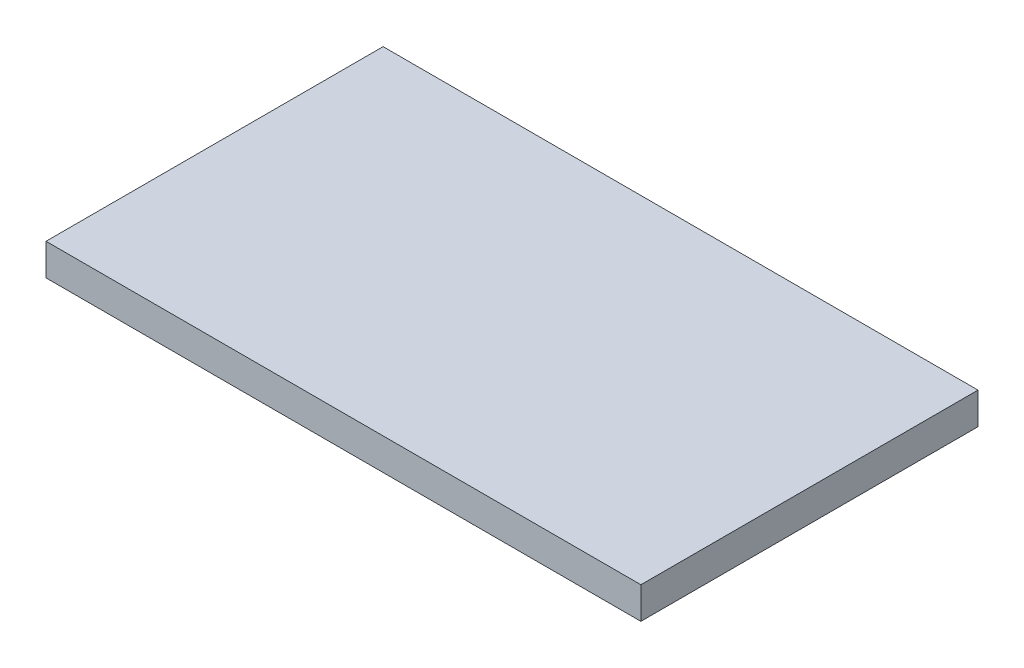
ISO-10303-21;
HEADER;
FILE_DESCRIPTION(('STEP AP214'),'2;1');
FILE_NAME('part.step','',(''),(''),'','','');
FILE_SCHEMA(('AUTOMOTIVE_DESIGN { 1 0 10303 214 1 1 1 1 }'));
ENDSEC;
DATA;
#1=APPLICATION_CONTEXT('core data for automotive mechanical design processes');
#2=APPLICATION_PROTOCOL_DEFINITION('international standard','automotive_design',2000,#1);
#3=PRODUCT_CONTEXT('',#1,'mechanical');
#4=PRODUCT('Part','Part','',(#3));
#5=PRODUCT_RELATED_PRODUCT_CATEGORY('part','',(#4));
#6=PRODUCT_DEFINITION_FORMATION('','',#4);
#7=PRODUCT_DEFINITION_CONTEXT('part definition',#1,'design');
#8=PRODUCT_DEFINITION('design','',#6,#7);
#9=PRODUCT_DEFINITION_SHAPE('','',#8);
#10=(LENGTH_UNIT() NAMED_UNIT(*) SI_UNIT(.MILLI.,.METRE.));
#11=(NAMED_UNIT(*) PLANE_ANGLE_UNIT() SI_UNIT($,.RADIAN.));
#12=(NAMED_UNIT(*) SI_UNIT($,.STERADIAN.) SOLID_ANGLE_UNIT());
#13=UNCERTAINTY_MEASURE_WITH_UNIT(LENGTH_MEASURE(1.E-05),#10,'distance_accuracy_value','');
#14=(GEOMETRIC_REPRESENTATION_CONTEXT(3) GLOBAL_UNCERTAINTY_ASSIGNED_CONTEXT((#13)) GLOBAL_UNIT_ASSIGNED_CONTEXT((#10,
#11,#12)) REPRESENTATION_CONTEXT('',''));
#15=CARTESIAN_POINT('',(0.,0.,0.));
#16=DIRECTION('',(0.,0.,1.));
#17=DIRECTION('',(1.,0.,0.));
#18=AXIS2_PLACEMENT_3D('',#15,#16,#17);
#19=CARTESIAN_POINT('',(-75.,8.,42.5));
#20=DIRECTION('',(1.,0.,0.));
#21=DIRECTION('',(0.,0.,-1.));
#22=AXIS2_PLACEMENT_3D('',#19,#20,#21);
#23=PLANE('',#22);
#24=DIRECTION('',(0.,0.,1.));
#25=VECTOR('',#24,1.);
#26=CARTESIAN_POINT('',(-75.,0.,42.5));
#27=LINE('',#26,#25);
#28=CARTESIAN_POINT('',(-75.,0.,-42.5));
#29=VERTEX_POINT('',#28);
#30=CARTESIAN_POINT('',(-75.,0.,42.5));
#31=VERTEX_POINT('',#30);
#32=EDGE_CURVE('E97',#29,#31,#27,.T.);
#33=ORIENTED_EDGE('',*,*,#32,.T.);
#34=DIRECTION('',(0.,-1.,0.));
#35=VECTOR('',#34,1.);
#36=CARTESIAN_POINT('',(-75.,8.,42.5));
#37=LINE('',#36,#35);
#38=CARTESIAN_POINT('',(-75.,8.,42.5));
#39=VERTEX_POINT('',#38);
#40=EDGE_CURVE('E11',#39,#31,#37,.T.);
#41=ORIENTED_EDGE('',*,*,#40,.F.);
#42=DIRECTION('',(0.,0.,1.));
#43=VECTOR('',#42,1.);
#44=CARTESIAN_POINT('',(-75.,8.,42.5));
#45=LINE('',#44,#43);
#46=CARTESIAN_POINT('',(-75.,8.,-42.5));
#47=VERTEX_POINT('',#46);
#48=EDGE_CURVE('E85',#47,#39,#45,.T.);
#49=ORIENTED_EDGE('',*,*,#48,.F.);
#50=DIRECTION('',(0.,-1.,0.));
#51=VECTOR('',#50,1.);
#52=CARTESIAN_POINT('',(-75.,8.,-42.5));
#53=LINE('',#52,#51);
#54=EDGE_CURVE('E93',#47,#29,#53,.T.);
#55=ORIENTED_EDGE('',*,*,#54,.T.);
#56=EDGE_LOOP('',(#33,#41,#49,#55));
#57=FACE_BOUND('',#56,.T.);
#58=ADVANCED_FACE('F34',(#57),#23,.F.);
#59=CARTESIAN_POINT('',(75.,8.,42.5));
#60=DIRECTION('',(0.,0.,-1.));
#61=DIRECTION('',(-1.,0.,0.));
#62=AXIS2_PLACEMENT_3D('',#59,#60,#61);
#63=PLANE('',#62);
#64=DIRECTION('',(1.,0.,0.));
#65=VECTOR('',#64,1.);
#66=CARTESIAN_POINT('',(75.,0.,42.5));
#67=LINE('',#66,#65);
#68=CARTESIAN_POINT('',(75.,0.,42.5));
#69=VERTEX_POINT('',#68);
#70=EDGE_CURVE('E89',#31,#69,#67,.T.);
#71=ORIENTED_EDGE('',*,*,#70,.T.);
#72=DIRECTION('',(0.,-1.,0.));
#73=VECTOR('',#72,1.);
#74=CARTESIAN_POINT('',(75.,8.,42.5));
#75=LINE('',#74,#73);
#76=CARTESIAN_POINT('',(75.,8.,42.5));
#77=VERTEX_POINT('',#76);
#78=EDGE_CURVE('E42',#77,#69,#75,.T.);
#79=ORIENTED_EDGE('',*,*,#78,.F.);
#80=DIRECTION('',(1.,0.,0.));
#81=VECTOR('',#80,1.);
#82=CARTESIAN_POINT('',(75.,8.,42.5));
#83=LINE('',#82,#81);
#84=EDGE_CURVE('E80',#39,#77,#83,.T.);
#85=ORIENTED_EDGE('',*,*,#84,.F.);
#86=ORIENTED_EDGE('',*,*,#40,.T.);
#87=EDGE_LOOP('',(#71,#79,#85,#86));
#88=FACE_BOUND('',#87,.T.);
#89=ADVANCED_FACE('F88',(#88),#63,.F.);
#90=CARTESIAN_POINT('',(75.,8.,42.5));
#91=DIRECTION('',(-1.,0.,0.));
#92=DIRECTION('',(0.,0.,1.));
#93=AXIS2_PLACEMENT_3D('',#90,#91,#92);
#94=PLANE('',#93);
#95=DIRECTION('',(0.,0.,-1.));
#96=VECTOR('',#95,1.);
#97=CARTESIAN_POINT('',(75.,0.,42.5));
#98=LINE('',#97,#96);
#99=CARTESIAN_POINT('',(75.,0.,-42.5));
#100=VERTEX_POINT('',#99);
#101=EDGE_CURVE('E67',#69,#100,#98,.T.);
#102=ORIENTED_EDGE('',*,*,#101,.T.);
#103=DIRECTION('',(0.,-1.,0.));
#104=VECTOR('',#103,1.);
#105=CARTESIAN_POINT('',(75.,8.,-42.5));
#106=LINE('',#105,#104);
#107=CARTESIAN_POINT('',(75.,8.,-42.5));
#108=VERTEX_POINT('',#107);
#109=EDGE_CURVE('E90',#108,#100,#106,.T.);
#110=ORIENTED_EDGE('',*,*,#109,.F.);
#111=DIRECTION('',(0.,0.,-1.));
#112=VECTOR('',#111,1.);
#113=CARTESIAN_POINT('',(75.,8.,42.5));
#114=LINE('',#113,#112);
#115=EDGE_CURVE('E83',#77,#108,#114,.T.);
#116=ORIENTED_EDGE('',*,*,#115,.F.);
#117=ORIENTED_EDGE('',*,*,#78,.T.);
#118=EDGE_LOOP('',(#102,#110,#116,#117));
#119=FACE_BOUND('',#118,.T.);
#120=ADVANCED_FACE('F91',(#119),#94,.F.);
#121=CARTESIAN_POINT('',(75.,8.,-42.5));
#122=DIRECTION('',(0.,0.,1.));
#123=DIRECTION('',(1.,0.,0.));
#124=AXIS2_PLACEMENT_3D('',#121,#122,#123);
#125=PLANE('',#124);
#126=DIRECTION('',(-1.,0.,0.));
#127=VECTOR('',#126,1.);
#128=CARTESIAN_POINT('',(75.,0.,-42.5));
#129=LINE('',#128,#127);
#130=EDGE_CURVE('E73',#100,#29,#129,.T.);
#131=ORIENTED_EDGE('',*,*,#130,.T.);
#132=ORIENTED_EDGE('',*,*,#54,.F.);
#133=DIRECTION('',(-1.,0.,0.));
#134=VECTOR('',#133,1.);
#135=CARTESIAN_POINT('',(75.,8.,-42.5));
#136=LINE('',#135,#134);
#137=EDGE_CURVE('E50',#108,#47,#136,.T.);
#138=ORIENTED_EDGE('',*,*,#137,.F.);
#139=ORIENTED_EDGE('',*,*,#109,.T.);
#140=EDGE_LOOP('',(#131,#132,#138,#139));
#141=FACE_BOUND('',#140,.T.);
#142=ADVANCED_FACE('F104',(#141),#125,.F.);
#143=CARTESIAN_POINT('',(0.,8.,0.));
#144=DIRECTION('',(0.,1.,0.));
#145=DIRECTION('',(0.,0.,1.));
#146=AXIS2_PLACEMENT_3D('',#143,#144,#145);
#147=PLANE('',#146);
#148=ORIENTED_EDGE('',*,*,#48,.T.);
#149=ORIENTED_EDGE('',*,*,#84,.T.);
#150=ORIENTED_EDGE('',*,*,#115,.T.);
#151=ORIENTED_EDGE('',*,*,#137,.T.);
#152=EDGE_LOOP('',(#148,#149,#150,#151));
#153=FACE_BOUND('',#152,.T.);
#154=ADVANCED_FACE('F81',(#153),#147,.T.);
#155=CARTESIAN_POINT('',(0.,0.,0.));
#156=DIRECTION('',(0.,1.,0.));
#157=DIRECTION('',(0.,0.,1.));
#158=AXIS2_PLACEMENT_3D('',#155,#156,#157);
#159=PLANE('',#158);
#160=ORIENTED_EDGE('',*,*,#32,.F.);
#161=ORIENTED_EDGE('',*,*,#130,.F.);
#162=ORIENTED_EDGE('',*,*,#101,.F.);
#163=ORIENTED_EDGE('',*,*,#70,.F.);
#164=EDGE_LOOP('',(#160,#161,#162,#163));
#165=FACE_BOUND('',#164,.T.);
#166=ADVANCED_FACE('F107',(#165),#159,.F.);
#167=CLOSED_SHELL('',(#58,#89,#120,#142,#154,#166));
#168=MANIFOLD_SOLID_BREP('B2',#167);
#169=ADVANCED_BREP_SHAPE_REPRESENTATION('',(#18,#168),#14);
#170=SHAPE_DEFINITION_REPRESENTATION(#9,#169);
ENDSEC;
END-ISO-10303-21;
